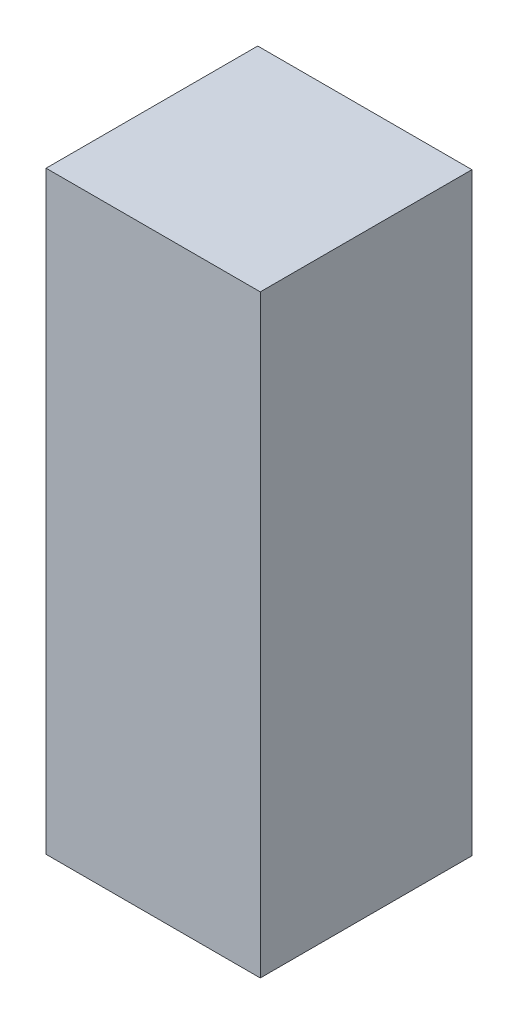
ISO-10303-21;
HEADER;
FILE_DESCRIPTION(('STEP AP214'),'2;1');
FILE_NAME('part.step','',(''),(''),'','','');
FILE_SCHEMA(('AUTOMOTIVE_DESIGN { 1 0 10303 214 1 1 1 1 }'));
ENDSEC;
DATA;
#1=APPLICATION_CONTEXT('core data for automotive mechanical design processes');
#2=APPLICATION_PROTOCOL_DEFINITION('international standard','automotive_design',2000,#1);
#3=PRODUCT_CONTEXT('',#1,'mechanical');
#4=PRODUCT('Part','Part','',(#3));
#5=PRODUCT_RELATED_PRODUCT_CATEGORY('part','',(#4));
#6=PRODUCT_DEFINITION_FORMATION('','',#4);
#7=PRODUCT_DEFINITION_CONTEXT('part definition',#1,'design');
#8=PRODUCT_DEFINITION('design','',#6,#7);
#9=PRODUCT_DEFINITION_SHAPE('','',#8);
#10=(LENGTH_UNIT() NAMED_UNIT(*) SI_UNIT(.MILLI.,.METRE.));
#11=(NAMED_UNIT(*) PLANE_ANGLE_UNIT() SI_UNIT($,.RADIAN.));
#12=(NAMED_UNIT(*) SI_UNIT($,.STERADIAN.) SOLID_ANGLE_UNIT());
#13=UNCERTAINTY_MEASURE_WITH_UNIT(LENGTH_MEASURE(1.E-05),#10,'distance_accuracy_value','');
#14=(GEOMETRIC_REPRESENTATION_CONTEXT(3) GLOBAL_UNCERTAINTY_ASSIGNED_CONTEXT((#13)) GLOBAL_UNIT_ASSIGNED_CONTEXT((#10,
#11,#12)) REPRESENTATION_CONTEXT('',''));
#15=CARTESIAN_POINT('',(0.,0.,0.));
#16=DIRECTION('',(0.,0.,1.));
#17=DIRECTION('',(1.,0.,0.));
#18=AXIS2_PLACEMENT_3D('',#15,#16,#17);
#19=CARTESIAN_POINT('',(10.16,28.1851835950481,15.2026247130824));
#20=DIRECTION('',(0.,0.,-1.));
#21=DIRECTION('',(-1.,0.,0.));
#22=AXIS2_PLACEMENT_3D('',#19,#20,#21);
#23=PLANE('',#22);
#24=DIRECTION('',(0.,-1.,0.));
#25=VECTOR('',#24,1.);
#26=CARTESIAN_POINT('',(0.,28.1851835950481,15.2026247130824));
#27=LINE('',#26,#25);
#28=CARTESIAN_POINT('',(0.,28.1851835950481,15.2026247130824));
#29=VERTEX_POINT('',#28);
#30=CARTESIAN_POINT('',(0.,0.,15.2026247130824));
#31=VERTEX_POINT('',#30);
#32=EDGE_CURVE('E96',#29,#31,#27,.T.);
#33=ORIENTED_EDGE('',*,*,#32,.T.);
#34=DIRECTION('',(-1.,0.,0.));
#35=VECTOR('',#34,1.);
#36=CARTESIAN_POINT('',(10.16,0.,15.2026247130824));
#37=LINE('',#36,#35);
#38=CARTESIAN_POINT('',(10.16,0.,15.2026247130824));
#39=VERTEX_POINT('',#38);
#40=EDGE_CURVE('E11',#39,#31,#37,.T.);
#41=ORIENTED_EDGE('',*,*,#40,.F.);
#42=DIRECTION('',(0.,-1.,0.));
#43=VECTOR('',#42,1.);
#44=CARTESIAN_POINT('',(10.16,28.1851835950481,15.2026247130824));
#45=LINE('',#44,#43);
#46=CARTESIAN_POINT('',(10.16,28.1851835950481,15.2026247130824));
#47=VERTEX_POINT('',#46);
#48=EDGE_CURVE('E84',#47,#39,#45,.T.);
#49=ORIENTED_EDGE('',*,*,#48,.F.);
#50=DIRECTION('',(-1.,0.,0.));
#51=VECTOR('',#50,1.);
#52=CARTESIAN_POINT('',(10.16,28.1851835950481,15.2026247130824));
#53=LINE('',#52,#51);
#54=EDGE_CURVE('E92',#47,#29,#53,.T.);
#55=ORIENTED_EDGE('',*,*,#54,.T.);
#56=EDGE_LOOP('',(#33,#41,#49,#55));
#57=FACE_BOUND('',#56,.T.);
#58=ADVANCED_FACE('F33',(#57),#23,.F.);
#59=CARTESIAN_POINT('',(10.16,0.,15.2026247130824));
#60=DIRECTION('',(0.,1.,0.));
#61=DIRECTION('',(0.,0.,1.));
#62=AXIS2_PLACEMENT_3D('',#59,#60,#61);
#63=PLANE('',#62);
#64=DIRECTION('',(0.,0.,-1.));
#65=VECTOR('',#64,1.);
#66=CARTESIAN_POINT('',(0.,0.,15.2026247130824));
#67=LINE('',#66,#65);
#68=CARTESIAN_POINT('',(0.,0.,5.16406617238038));
#69=VERTEX_POINT('',#68);
#70=EDGE_CURVE('E88',#31,#69,#67,.T.);
#71=ORIENTED_EDGE('',*,*,#70,.T.);
#72=DIRECTION('',(-1.,0.,0.));
#73=VECTOR('',#72,1.);
#74=CARTESIAN_POINT('',(10.16,0.,5.16406617238038));
#75=LINE('',#74,#73);
#76=CARTESIAN_POINT('',(10.16,0.,5.16406617238038));
#77=VERTEX_POINT('',#76);
#78=EDGE_CURVE('E41',#77,#69,#75,.T.);
#79=ORIENTED_EDGE('',*,*,#78,.F.);
#80=DIRECTION('',(0.,0.,-1.));
#81=VECTOR('',#80,1.);
#82=CARTESIAN_POINT('',(10.16,0.,15.2026247130824));
#83=LINE('',#82,#81);
#84=EDGE_CURVE('E79',#39,#77,#83,.T.);
#85=ORIENTED_EDGE('',*,*,#84,.F.);
#86=ORIENTED_EDGE('',*,*,#40,.T.);
#87=EDGE_LOOP('',(#71,#79,#85,#86));
#88=FACE_BOUND('',#87,.T.);
#89=ADVANCED_FACE('F87',(#88),#63,.F.);
#90=CARTESIAN_POINT('',(10.16,28.1851835950481,5.16406617238038));
#91=DIRECTION('',(0.,0.,1.));
#92=DIRECTION('',(1.,0.,0.));
#93=AXIS2_PLACEMENT_3D('',#90,#91,#92);
#94=PLANE('',#93);
#95=DIRECTION('',(0.,1.,0.));
#96=VECTOR('',#95,1.);
#97=CARTESIAN_POINT('',(0.,28.1851835950481,5.16406617238038));
#98=LINE('',#97,#96);
#99=CARTESIAN_POINT('',(0.,28.1851835950481,5.16406617238038));
#100=VERTEX_POINT('',#99);
#101=EDGE_CURVE('E66',#69,#100,#98,.T.);
#102=ORIENTED_EDGE('',*,*,#101,.T.);
#103=DIRECTION('',(-1.,0.,0.));
#104=VECTOR('',#103,1.);
#105=CARTESIAN_POINT('',(10.16,28.1851835950481,5.16406617238038));
#106=LINE('',#105,#104);
#107=CARTESIAN_POINT('',(10.16,28.1851835950481,5.16406617238038));
#108=VERTEX_POINT('',#107);
#109=EDGE_CURVE('E89',#108,#100,#106,.T.);
#110=ORIENTED_EDGE('',*,*,#109,.F.);
#111=DIRECTION('',(0.,1.,0.));
#112=VECTOR('',#111,1.);
#113=CARTESIAN_POINT('',(10.16,28.1851835950481,5.16406617238038));
#114=LINE('',#113,#112);
#115=EDGE_CURVE('E82',#77,#108,#114,.T.);
#116=ORIENTED_EDGE('',*,*,#115,.F.);
#117=ORIENTED_EDGE('',*,*,#78,.T.);
#118=EDGE_LOOP('',(#102,#110,#116,#117));
#119=FACE_BOUND('',#118,.T.);
#120=ADVANCED_FACE('F90',(#119),#94,.F.);
#121=CARTESIAN_POINT('',(10.16,28.1851835950481,15.2026247130824));
#122=DIRECTION('',(0.,-1.,0.));
#123=DIRECTION('',(0.,0.,-1.));
#124=AXIS2_PLACEMENT_3D('',#121,#122,#123);
#125=PLANE('',#124);
#126=DIRECTION('',(0.,0.,1.));
#127=VECTOR('',#126,1.);
#128=CARTESIAN_POINT('',(0.,28.1851835950481,15.2026247130824));
#129=LINE('',#128,#127);
#130=EDGE_CURVE('E72',#100,#29,#129,.T.);
#131=ORIENTED_EDGE('',*,*,#130,.T.);
#132=ORIENTED_EDGE('',*,*,#54,.F.);
#133=DIRECTION('',(0.,0.,1.));
#134=VECTOR('',#133,1.);
#135=CARTESIAN_POINT('',(10.16,28.1851835950481,15.2026247130824));
#136=LINE('',#135,#134);
#137=EDGE_CURVE('E49',#108,#47,#136,.T.);
#138=ORIENTED_EDGE('',*,*,#137,.F.);
#139=ORIENTED_EDGE('',*,*,#109,.T.);
#140=EDGE_LOOP('',(#131,#132,#138,#139));
#141=FACE_BOUND('',#140,.T.);
#142=ADVANCED_FACE('F103',(#141),#125,.F.);
#143=CARTESIAN_POINT('',(10.16,0.,0.));
#144=DIRECTION('',(1.,0.,0.));
#145=DIRECTION('',(0.,0.,-1.));
#146=AXIS2_PLACEMENT_3D('',#143,#144,#145);
#147=PLANE('',#146);
#148=ORIENTED_EDGE('',*,*,#48,.T.);
#149=ORIENTED_EDGE('',*,*,#84,.T.);
#150=ORIENTED_EDGE('',*,*,#115,.T.);
#151=ORIENTED_EDGE('',*,*,#137,.T.);
#152=EDGE_LOOP('',(#148,#149,#150,#151));
#153=FACE_BOUND('',#152,.T.);
#154=ADVANCED_FACE('F80',(#153),#147,.T.);
#155=CARTESIAN_POINT('',(0.,0.,0.));
#156=DIRECTION('',(1.,0.,0.));
#157=DIRECTION('',(0.,0.,-1.));
#158=AXIS2_PLACEMENT_3D('',#155,#156,#157);
#159=PLANE('',#158);
#160=ORIENTED_EDGE('',*,*,#32,.F.);
#161=ORIENTED_EDGE('',*,*,#130,.F.);
#162=ORIENTED_EDGE('',*,*,#101,.F.);
#163=ORIENTED_EDGE('',*,*,#70,.F.);
#164=EDGE_LOOP('',(#160,#161,#162,#163));
#165=FACE_BOUND('',#164,.T.);
#166=ADVANCED_FACE('F106',(#165),#159,.F.);
#167=CLOSED_SHELL('',(#58,#89,#120,#142,#154,#166));
#168=MANIFOLD_SOLID_BREP('B2',#167);
#169=ADVANCED_BREP_SHAPE_REPRESENTATION('',(#18,#168),#14);
#170=SHAPE_DEFINITION_REPRESENTATION(#9,#169);
ENDSEC;
END-ISO-10303-21;
